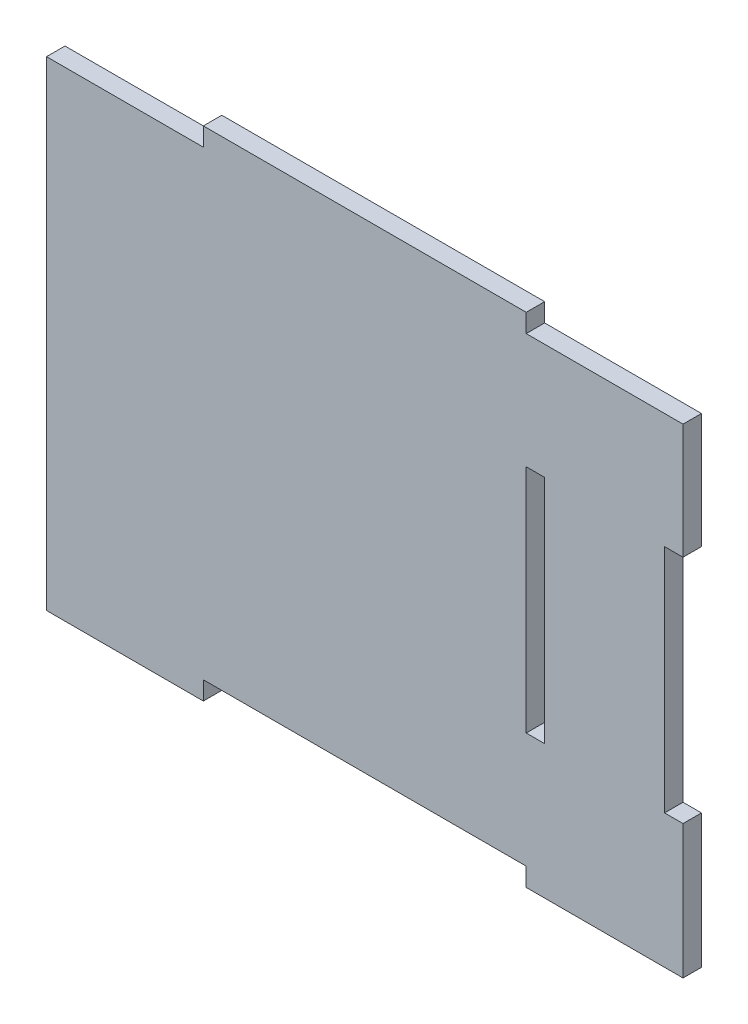
ISO-10303-21;
HEADER;
FILE_DESCRIPTION(('STEP AP214'),'2;1');
FILE_NAME('part.step','',(''),(''),'','','');
FILE_SCHEMA(('AUTOMOTIVE_DESIGN { 1 0 10303 214 1 1 1 1 }'));
ENDSEC;
DATA;
#1=APPLICATION_CONTEXT('core data for automotive mechanical design processes');
#2=APPLICATION_PROTOCOL_DEFINITION('international standard','automotive_design',2000,#1);
#3=PRODUCT_CONTEXT('',#1,'mechanical');
#4=PRODUCT('Part','Part','',(#3));
#5=PRODUCT_RELATED_PRODUCT_CATEGORY('part','',(#4));
#6=PRODUCT_DEFINITION_FORMATION('','',#4);
#7=PRODUCT_DEFINITION_CONTEXT('part definition',#1,'design');
#8=PRODUCT_DEFINITION('design','',#6,#7);
#9=PRODUCT_DEFINITION_SHAPE('','',#8);
#10=(LENGTH_UNIT() NAMED_UNIT(*) SI_UNIT(.MILLI.,.METRE.));
#11=(NAMED_UNIT(*) PLANE_ANGLE_UNIT() SI_UNIT($,.RADIAN.));
#12=(NAMED_UNIT(*) SI_UNIT($,.STERADIAN.) SOLID_ANGLE_UNIT());
#13=UNCERTAINTY_MEASURE_WITH_UNIT(LENGTH_MEASURE(1.E-05),#10,'distance_accuracy_value','');
#14=(GEOMETRIC_REPRESENTATION_CONTEXT(3) GLOBAL_UNCERTAINTY_ASSIGNED_CONTEXT((#13)) GLOBAL_UNIT_ASSIGNED_CONTEXT((#10,
#11,#12)) REPRESENTATION_CONTEXT('',''));
#15=CARTESIAN_POINT('',(0.,0.,0.));
#16=DIRECTION('',(0.,0.,1.));
#17=DIRECTION('',(1.,0.,0.));
#18=AXIS2_PLACEMENT_3D('',#15,#16,#17);
#19=CARTESIAN_POINT('',(0.,0.,4.));
#20=DIRECTION('',(0.,0.,-1.));
#21=DIRECTION('',(-1.,0.,0.));
#22=AXIS2_PLACEMENT_3D('',#19,#20,#21);
#23=PLANE('',#22);
#24=DIRECTION('',(-1.,0.,0.));
#25=VECTOR('',#24,1.);
#26=CARTESIAN_POINT('',(64.6196365221436,50.6073636958039,4.));
#27=LINE('',#26,#25);
#28=CARTESIAN_POINT('',(68.6196365221436,50.6073636958039,4.));
#29=VERTEX_POINT('',#28);
#30=CARTESIAN_POINT('',(34.6196365221436,50.6073636958039,4.));
#31=VERTEX_POINT('',#30);
#32=EDGE_CURVE('E206',#29,#31,#27,.T.);
#33=ORIENTED_EDGE('',*,*,#32,.T.);
#34=DIRECTION('',(0.,1.,0.));
#35=VECTOR('',#34,1.);
#36=CARTESIAN_POINT('',(34.6196365221436,50.6073636958039,4.));
#37=LINE('',#36,#35);
#38=CARTESIAN_POINT('',(34.6196365221436,54.6073636958039,4.));
#39=VERTEX_POINT('',#38);
#40=EDGE_CURVE('E208',#31,#39,#37,.T.);
#41=ORIENTED_EDGE('',*,*,#40,.T.);
#42=DIRECTION('',(-1.,0.,0.));
#43=VECTOR('',#42,1.);
#44=CARTESIAN_POINT('',(-35.3803634778564,54.6073636958039,4.));
#45=LINE('',#44,#43);
#46=CARTESIAN_POINT('',(-35.3803634778564,54.6073636958039,4.));
#47=VERTEX_POINT('',#46);
#48=EDGE_CURVE('E211',#39,#47,#45,.T.);
#49=ORIENTED_EDGE('',*,*,#48,.T.);
#50=DIRECTION('',(0.,-1.,0.));
#51=VECTOR('',#50,1.);
#52=CARTESIAN_POINT('',(-35.3803634778564,50.6073636958039,4.));
#53=LINE('',#52,#51);
#54=CARTESIAN_POINT('',(-35.3803634778564,50.6073636958039,4.));
#55=VERTEX_POINT('',#54);
#56=EDGE_CURVE('E213',#47,#55,#53,.T.);
#57=ORIENTED_EDGE('',*,*,#56,.T.);
#58=DIRECTION('',(-1.,0.,0.));
#59=VECTOR('',#58,1.);
#60=CARTESIAN_POINT('',(-35.3803634778564,50.6073636958039,4.));
#61=LINE('',#60,#59);
#62=CARTESIAN_POINT('',(-69.3803634778564,50.6073636958039,4.));
#63=VERTEX_POINT('',#62);
#64=EDGE_CURVE('E215',#55,#63,#61,.T.);
#65=ORIENTED_EDGE('',*,*,#64,.T.);
#66=DIRECTION('',(0.,-1.,0.));
#67=VECTOR('',#66,1.);
#68=CARTESIAN_POINT('',(-69.3803634778564,50.6073636958039,4.));
#69=LINE('',#68,#67);
#70=CARTESIAN_POINT('',(-69.3803634778564,-53.3926363041961,4.));
#71=VERTEX_POINT('',#70);
#72=EDGE_CURVE('E217',#63,#71,#69,.T.);
#73=ORIENTED_EDGE('',*,*,#72,.T.);
#74=DIRECTION('',(1.,0.,0.));
#75=VECTOR('',#74,1.);
#76=CARTESIAN_POINT('',(-65.3803634778564,-53.3926363041962,4.));
#77=LINE('',#76,#75);
#78=CARTESIAN_POINT('',(-35.3803634778564,-53.3926363041962,4.));
#79=VERTEX_POINT('',#78);
#80=EDGE_CURVE('E219',#71,#79,#77,.T.);
#81=ORIENTED_EDGE('',*,*,#80,.T.);
#82=DIRECTION('',(0.,1.,0.));
#83=VECTOR('',#82,1.);
#84=CARTESIAN_POINT('',(-35.3803634778564,-49.3926363041961,4.));
#85=LINE('',#84,#83);
#86=CARTESIAN_POINT('',(-35.3803634778564,-49.3926363041961,4.));
#87=VERTEX_POINT('',#86);
#88=EDGE_CURVE('E221',#79,#87,#85,.T.);
#89=ORIENTED_EDGE('',*,*,#88,.T.);
#90=DIRECTION('',(1.,0.,0.));
#91=VECTOR('',#90,1.);
#92=CARTESIAN_POINT('',(34.6196365221436,-49.3926363041961,4.));
#93=LINE('',#92,#91);
#94=CARTESIAN_POINT('',(34.6196365221436,-49.3926363041961,4.));
#95=VERTEX_POINT('',#94);
#96=EDGE_CURVE('E223',#87,#95,#93,.T.);
#97=ORIENTED_EDGE('',*,*,#96,.T.);
#98=DIRECTION('',(0.,-1.,0.));
#99=VECTOR('',#98,1.);
#100=CARTESIAN_POINT('',(34.6196365221436,-49.3926363041961,4.));
#101=LINE('',#100,#99);
#102=CARTESIAN_POINT('',(34.6196365221436,-53.3926363041961,4.));
#103=VERTEX_POINT('',#102);
#104=EDGE_CURVE('E225',#95,#103,#101,.T.);
#105=ORIENTED_EDGE('',*,*,#104,.T.);
#106=DIRECTION('',(1.,0.,0.));
#107=VECTOR('',#106,1.);
#108=CARTESIAN_POINT('',(64.6196365221436,-53.3926363041961,4.));
#109=LINE('',#108,#107);
#110=CARTESIAN_POINT('',(68.6196365221437,-53.3926363041961,4.));
#111=VERTEX_POINT('',#110);
#112=EDGE_CURVE('E227',#103,#111,#109,.T.);
#113=ORIENTED_EDGE('',*,*,#112,.T.);
#114=DIRECTION('',(0.,1.,0.));
#115=VECTOR('',#114,1.);
#116=CARTESIAN_POINT('',(68.6196365221437,-24.3926363041961,4.));
#117=LINE('',#116,#115);
#118=CARTESIAN_POINT('',(68.6196365221437,-24.3926363041961,4.));
#119=VERTEX_POINT('',#118);
#120=EDGE_CURVE('E229',#111,#119,#117,.T.);
#121=ORIENTED_EDGE('',*,*,#120,.T.);
#122=DIRECTION('',(-1.,0.,0.));
#123=VECTOR('',#122,1.);
#124=CARTESIAN_POINT('',(64.6196365221436,-24.3926363041961,4.));
#125=LINE('',#124,#123);
#126=CARTESIAN_POINT('',(64.6196365221436,-24.3926363041961,4.));
#127=VERTEX_POINT('',#126);
#128=EDGE_CURVE('E231',#119,#127,#125,.T.);
#129=ORIENTED_EDGE('',*,*,#128,.T.);
#130=DIRECTION('',(0.,1.,0.));
#131=VECTOR('',#130,1.);
#132=CARTESIAN_POINT('',(64.6196365221436,-24.3926363041961,4.));
#133=LINE('',#132,#131);
#134=CARTESIAN_POINT('',(64.6196365221436,25.6073636958039,4.));
#135=VERTEX_POINT('',#134);
#136=EDGE_CURVE('E233',#127,#135,#133,.T.);
#137=ORIENTED_EDGE('',*,*,#136,.T.);
#138=DIRECTION('',(1.,0.,0.));
#139=VECTOR('',#138,1.);
#140=CARTESIAN_POINT('',(64.6196365221436,25.6073636958039,4.));
#141=LINE('',#140,#139);
#142=CARTESIAN_POINT('',(68.6196365221436,25.6073636958039,4.));
#143=VERTEX_POINT('',#142);
#144=EDGE_CURVE('E235',#135,#143,#141,.T.);
#145=ORIENTED_EDGE('',*,*,#144,.T.);
#146=DIRECTION('',(0.,1.,0.));
#147=VECTOR('',#146,1.);
#148=CARTESIAN_POINT('',(68.6196365221436,50.6073636958039,4.));
#149=LINE('',#148,#147);
#150=EDGE_CURVE('E237',#143,#29,#149,.T.);
#151=ORIENTED_EDGE('',*,*,#150,.T.);
#152=EDGE_LOOP('',(#33,#41,#49,#57,#65,#73,#81,#89,#97,#105,#113,#121,#129,#137,#145,#151));
#153=FACE_BOUND('',#152,.T.);
#154=DIRECTION('',(0.,-1.,0.));
#155=VECTOR('',#154,1.);
#156=CARTESIAN_POINT('',(34.6196365221436,25.6073636958039,4.));
#157=LINE('',#156,#155);
#158=CARTESIAN_POINT('',(34.6196365221436,25.6073636958039,4.));
#159=VERTEX_POINT('',#158);
#160=CARTESIAN_POINT('',(34.6196365221436,-24.3926363041961,4.));
#161=VERTEX_POINT('',#160);
#162=EDGE_CURVE('E170',#159,#161,#157,.T.);
#163=ORIENTED_EDGE('',*,*,#162,.F.);
#164=DIRECTION('',(-1.,0.,0.));
#165=VECTOR('',#164,1.);
#166=CARTESIAN_POINT('',(34.6196365221436,25.6073636958039,4.));
#167=LINE('',#166,#165);
#168=CARTESIAN_POINT('',(38.6196365221436,25.6073636958039,4.));
#169=VERTEX_POINT('',#168);
#170=EDGE_CURVE('E192',#169,#159,#167,.T.);
#171=ORIENTED_EDGE('',*,*,#170,.F.);
#172=DIRECTION('',(0.,1.,0.));
#173=VECTOR('',#172,1.);
#174=CARTESIAN_POINT('',(38.6196365221436,25.6073636958039,4.));
#175=LINE('',#174,#173);
#176=CARTESIAN_POINT('',(38.6196365221436,-24.3926363041961,4.));
#177=VERTEX_POINT('',#176);
#178=EDGE_CURVE('E190',#177,#169,#175,.T.);
#179=ORIENTED_EDGE('',*,*,#178,.F.);
#180=DIRECTION('',(1.,0.,0.));
#181=VECTOR('',#180,1.);
#182=CARTESIAN_POINT('',(34.6196365221436,-24.3926363041961,4.));
#183=LINE('',#182,#181);
#184=EDGE_CURVE('E178',#161,#177,#183,.T.);
#185=ORIENTED_EDGE('',*,*,#184,.F.);
#186=EDGE_LOOP('',(#163,#171,#179,#185));
#187=FACE_BOUND('',#186,.T.);
#188=ADVANCED_FACE('F33',(#153,#187),#23,.F.);
#189=CARTESIAN_POINT('',(0.,0.,0.));
#190=DIRECTION('',(0.,0.,-1.));
#191=DIRECTION('',(-1.,0.,0.));
#192=AXIS2_PLACEMENT_3D('',#189,#190,#191);
#193=PLANE('',#192);
#194=DIRECTION('',(-1.,0.,0.));
#195=VECTOR('',#194,1.);
#196=CARTESIAN_POINT('',(64.6196365221436,50.6073636958039,0.));
#197=LINE('',#196,#195);
#198=CARTESIAN_POINT('',(68.6196365221436,50.6073636958039,0.));
#199=VERTEX_POINT('',#198);
#200=CARTESIAN_POINT('',(34.6196365221436,50.6073636958039,0.));
#201=VERTEX_POINT('',#200);
#202=EDGE_CURVE('E186',#199,#201,#197,.T.);
#203=ORIENTED_EDGE('',*,*,#202,.F.);
#204=DIRECTION('',(0.,1.,0.));
#205=VECTOR('',#204,1.);
#206=CARTESIAN_POINT('',(68.6196365221436,50.6073636958039,0.));
#207=LINE('',#206,#205);
#208=CARTESIAN_POINT('',(68.6196365221436,25.6073636958039,0.));
#209=VERTEX_POINT('',#208);
#210=EDGE_CURVE('E209',#209,#199,#207,.T.);
#211=ORIENTED_EDGE('',*,*,#210,.F.);
#212=DIRECTION('',(1.,0.,0.));
#213=VECTOR('',#212,1.);
#214=CARTESIAN_POINT('',(64.6196365221436,25.6073636958039,0.));
#215=LINE('',#214,#213);
#216=CARTESIAN_POINT('',(64.6196365221436,25.6073636958039,0.));
#217=VERTEX_POINT('',#216);
#218=EDGE_CURVE('E270',#217,#209,#215,.T.);
#219=ORIENTED_EDGE('',*,*,#218,.F.);
#220=DIRECTION('',(0.,1.,0.));
#221=VECTOR('',#220,1.);
#222=CARTESIAN_POINT('',(64.6196365221436,-24.3926363041961,0.));
#223=LINE('',#222,#221);
#224=CARTESIAN_POINT('',(64.6196365221436,-24.3926363041961,0.));
#225=VERTEX_POINT('',#224);
#226=EDGE_CURVE('E268',#225,#217,#223,.T.);
#227=ORIENTED_EDGE('',*,*,#226,.F.);
#228=DIRECTION('',(-1.,0.,0.));
#229=VECTOR('',#228,1.);
#230=CARTESIAN_POINT('',(64.6196365221436,-24.3926363041961,0.));
#231=LINE('',#230,#229);
#232=CARTESIAN_POINT('',(68.6196365221437,-24.3926363041961,0.));
#233=VERTEX_POINT('',#232);
#234=EDGE_CURVE('E266',#233,#225,#231,.T.);
#235=ORIENTED_EDGE('',*,*,#234,.F.);
#236=DIRECTION('',(0.,1.,0.));
#237=VECTOR('',#236,1.);
#238=CARTESIAN_POINT('',(68.6196365221437,-24.3926363041961,0.));
#239=LINE('',#238,#237);
#240=CARTESIAN_POINT('',(68.6196365221437,-53.3926363041961,0.));
#241=VERTEX_POINT('',#240);
#242=EDGE_CURVE('E264',#241,#233,#239,.T.);
#243=ORIENTED_EDGE('',*,*,#242,.F.);
#244=DIRECTION('',(1.,0.,0.));
#245=VECTOR('',#244,1.);
#246=CARTESIAN_POINT('',(64.6196365221436,-53.3926363041961,0.));
#247=LINE('',#246,#245);
#248=CARTESIAN_POINT('',(34.6196365221436,-53.3926363041961,0.));
#249=VERTEX_POINT('',#248);
#250=EDGE_CURVE('E262',#249,#241,#247,.T.);
#251=ORIENTED_EDGE('',*,*,#250,.F.);
#252=DIRECTION('',(0.,-1.,0.));
#253=VECTOR('',#252,1.);
#254=CARTESIAN_POINT('',(34.6196365221436,-49.3926363041961,0.));
#255=LINE('',#254,#253);
#256=CARTESIAN_POINT('',(34.6196365221436,-49.3926363041961,0.));
#257=VERTEX_POINT('',#256);
#258=EDGE_CURVE('E259',#257,#249,#255,.T.);
#259=ORIENTED_EDGE('',*,*,#258,.F.);
#260=DIRECTION('',(1.,0.,0.));
#261=VECTOR('',#260,1.);
#262=CARTESIAN_POINT('',(34.6196365221436,-49.3926363041961,0.));
#263=LINE('',#262,#261);
#264=CARTESIAN_POINT('',(-35.3803634778564,-49.3926363041961,0.));
#265=VERTEX_POINT('',#264);
#266=EDGE_CURVE('E257',#265,#257,#263,.T.);
#267=ORIENTED_EDGE('',*,*,#266,.F.);
#268=DIRECTION('',(0.,1.,0.));
#269=VECTOR('',#268,1.);
#270=CARTESIAN_POINT('',(-35.3803634778564,-49.3926363041961,0.));
#271=LINE('',#270,#269);
#272=CARTESIAN_POINT('',(-35.3803634778564,-53.3926363041962,0.));
#273=VERTEX_POINT('',#272);
#274=EDGE_CURVE('E255',#273,#265,#271,.T.);
#275=ORIENTED_EDGE('',*,*,#274,.F.);
#276=DIRECTION('',(1.,0.,0.));
#277=VECTOR('',#276,1.);
#278=CARTESIAN_POINT('',(-65.3803634778564,-53.3926363041962,0.));
#279=LINE('',#278,#277);
#280=CARTESIAN_POINT('',(-69.3803634778564,-53.3926363041961,0.));
#281=VERTEX_POINT('',#280);
#282=EDGE_CURVE('E253',#281,#273,#279,.T.);
#283=ORIENTED_EDGE('',*,*,#282,.F.);
#284=DIRECTION('',(0.,-1.,0.));
#285=VECTOR('',#284,1.);
#286=CARTESIAN_POINT('',(-69.3803634778564,50.6073636958039,0.));
#287=LINE('',#286,#285);
#288=CARTESIAN_POINT('',(-69.3803634778564,50.6073636958039,0.));
#289=VERTEX_POINT('',#288);
#290=EDGE_CURVE('E250',#289,#281,#287,.T.);
#291=ORIENTED_EDGE('',*,*,#290,.F.);
#292=DIRECTION('',(-1.,0.,0.));
#293=VECTOR('',#292,1.);
#294=CARTESIAN_POINT('',(-65.3803634778564,50.6073636958039,0.));
#295=LINE('',#294,#293);
#296=CARTESIAN_POINT('',(-35.3803634778564,50.6073636958039,0.));
#297=VERTEX_POINT('',#296);
#298=EDGE_CURVE('E248',#297,#289,#295,.T.);
#299=ORIENTED_EDGE('',*,*,#298,.F.);
#300=DIRECTION('',(0.,-1.,0.));
#301=VECTOR('',#300,1.);
#302=CARTESIAN_POINT('',(-35.3803634778564,50.6073636958039,0.));
#303=LINE('',#302,#301);
#304=CARTESIAN_POINT('',(-35.3803634778564,54.6073636958039,0.));
#305=VERTEX_POINT('',#304);
#306=EDGE_CURVE('E245',#305,#297,#303,.T.);
#307=ORIENTED_EDGE('',*,*,#306,.F.);
#308=DIRECTION('',(-1.,0.,0.));
#309=VECTOR('',#308,1.);
#310=CARTESIAN_POINT('',(-35.3803634778564,54.6073636958039,0.));
#311=LINE('',#310,#309);
#312=CARTESIAN_POINT('',(34.6196365221436,54.6073636958039,0.));
#313=VERTEX_POINT('',#312);
#314=EDGE_CURVE('E243',#313,#305,#311,.T.);
#315=ORIENTED_EDGE('',*,*,#314,.F.);
#316=DIRECTION('',(0.,1.,0.));
#317=VECTOR('',#316,1.);
#318=CARTESIAN_POINT('',(34.6196365221436,50.6073636958039,0.));
#319=LINE('',#318,#317);
#320=EDGE_CURVE('E241',#201,#313,#319,.T.);
#321=ORIENTED_EDGE('',*,*,#320,.F.);
#322=EDGE_LOOP('',(#203,#211,#219,#227,#235,#243,#251,#259,#267,#275,#283,#291,#299,#307,#315,#321));
#323=FACE_BOUND('',#322,.T.);
#324=DIRECTION('',(-1.,0.,0.));
#325=VECTOR('',#324,1.);
#326=CARTESIAN_POINT('',(34.6196365221436,25.6073636958039,0.));
#327=LINE('',#326,#325);
#328=CARTESIAN_POINT('',(38.6196365221436,25.6073636958039,0.));
#329=VERTEX_POINT('',#328);
#330=CARTESIAN_POINT('',(34.6196365221436,25.6073636958039,0.));
#331=VERTEX_POINT('',#330);
#332=EDGE_CURVE('E179',#329,#331,#327,.T.);
#333=ORIENTED_EDGE('',*,*,#332,.T.);
#334=DIRECTION('',(0.,-1.,0.));
#335=VECTOR('',#334,1.);
#336=CARTESIAN_POINT('',(34.6196365221436,25.6073636958039,0.));
#337=LINE('',#336,#335);
#338=CARTESIAN_POINT('',(34.6196365221436,-24.3926363041961,0.));
#339=VERTEX_POINT('',#338);
#340=EDGE_CURVE('E56',#331,#339,#337,.T.);
#341=ORIENTED_EDGE('',*,*,#340,.T.);
#342=DIRECTION('',(1.,0.,0.));
#343=VECTOR('',#342,1.);
#344=CARTESIAN_POINT('',(34.6196365221436,-24.3926363041961,0.));
#345=LINE('',#344,#343);
#346=CARTESIAN_POINT('',(38.6196365221436,-24.3926363041961,0.));
#347=VERTEX_POINT('',#346);
#348=EDGE_CURVE('E185',#339,#347,#345,.T.);
#349=ORIENTED_EDGE('',*,*,#348,.T.);
#350=DIRECTION('',(0.,1.,0.));
#351=VECTOR('',#350,1.);
#352=CARTESIAN_POINT('',(38.6196365221436,25.6073636958039,0.));
#353=LINE('',#352,#351);
#354=EDGE_CURVE('E198',#347,#329,#353,.T.);
#355=ORIENTED_EDGE('',*,*,#354,.T.);
#356=EDGE_LOOP('',(#333,#341,#349,#355));
#357=FACE_BOUND('',#356,.T.);
#358=ADVANCED_FACE('F326',(#323,#357),#193,.T.);
#359=CARTESIAN_POINT('',(64.6196365221436,50.6073636958039,4.));
#360=DIRECTION('',(0.,-1.,0.));
#361=DIRECTION('',(0.,0.,-1.));
#362=AXIS2_PLACEMENT_3D('',#359,#360,#361);
#363=PLANE('',#362);
#364=ORIENTED_EDGE('',*,*,#202,.T.);
#365=DIRECTION('',(0.,0.,-1.));
#366=VECTOR('',#365,1.);
#367=CARTESIAN_POINT('',(34.6196365221436,50.6073636958039,4.));
#368=LINE('',#367,#366);
#369=EDGE_CURVE('E11',#31,#201,#368,.T.);
#370=ORIENTED_EDGE('',*,*,#369,.F.);
#371=ORIENTED_EDGE('',*,*,#32,.F.);
#372=DIRECTION('',(0.,0.,-1.));
#373=VECTOR('',#372,1.);
#374=CARTESIAN_POINT('',(68.6196365221436,50.6073636958039,4.));
#375=LINE('',#374,#373);
#376=EDGE_CURVE('E239',#29,#199,#375,.T.);
#377=ORIENTED_EDGE('',*,*,#376,.T.);
#378=EDGE_LOOP('',(#364,#370,#371,#377));
#379=FACE_BOUND('',#378,.T.);
#380=ADVANCED_FACE('F35',(#379),#363,.F.);
#381=CARTESIAN_POINT('',(34.6196365221436,50.6073636958039,4.));
#382=DIRECTION('',(-1.,0.,0.));
#383=DIRECTION('',(0.,0.,1.));
#384=AXIS2_PLACEMENT_3D('',#381,#382,#383);
#385=PLANE('',#384);
#386=ORIENTED_EDGE('',*,*,#320,.T.);
#387=DIRECTION('',(0.,0.,-1.));
#388=VECTOR('',#387,1.);
#389=CARTESIAN_POINT('',(34.6196365221436,54.6073636958039,4.));
#390=LINE('',#389,#388);
#391=EDGE_CURVE('E41',#39,#313,#390,.T.);
#392=ORIENTED_EDGE('',*,*,#391,.F.);
#393=ORIENTED_EDGE('',*,*,#40,.F.);
#394=ORIENTED_EDGE('',*,*,#369,.T.);
#395=EDGE_LOOP('',(#386,#392,#393,#394));
#396=FACE_BOUND('',#395,.T.);
#397=ADVANCED_FACE('F342',(#396),#385,.F.);
#398=CARTESIAN_POINT('',(-35.3803634778564,54.6073636958039,4.));
#399=DIRECTION('',(0.,-1.,0.));
#400=DIRECTION('',(0.,0.,-1.));
#401=AXIS2_PLACEMENT_3D('',#398,#399,#400);
#402=PLANE('',#401);
#403=ORIENTED_EDGE('',*,*,#314,.T.);
#404=DIRECTION('',(0.,0.,-1.));
#405=VECTOR('',#404,1.);
#406=CARTESIAN_POINT('',(-35.3803634778564,54.6073636958039,4.));
#407=LINE('',#406,#405);
#408=EDGE_CURVE('E312',#47,#305,#407,.T.);
#409=ORIENTED_EDGE('',*,*,#408,.F.);
#410=ORIENTED_EDGE('',*,*,#48,.F.);
#411=ORIENTED_EDGE('',*,*,#391,.T.);
#412=EDGE_LOOP('',(#403,#409,#410,#411));
#413=FACE_BOUND('',#412,.T.);
#414=ADVANCED_FACE('F319',(#413),#402,.F.);
#415=CARTESIAN_POINT('',(-35.3803634778564,50.6073636958039,4.));
#416=DIRECTION('',(1.,0.,0.));
#417=DIRECTION('',(0.,0.,-1.));
#418=AXIS2_PLACEMENT_3D('',#415,#416,#417);
#419=PLANE('',#418);
#420=ORIENTED_EDGE('',*,*,#306,.T.);
#421=DIRECTION('',(0.,0.,-1.));
#422=VECTOR('',#421,1.);
#423=CARTESIAN_POINT('',(-35.3803634778564,50.6073636958039,4.));
#424=LINE('',#423,#422);
#425=EDGE_CURVE('E309',#55,#297,#424,.T.);
#426=ORIENTED_EDGE('',*,*,#425,.F.);
#427=ORIENTED_EDGE('',*,*,#56,.F.);
#428=ORIENTED_EDGE('',*,*,#408,.T.);
#429=EDGE_LOOP('',(#420,#426,#427,#428));
#430=FACE_BOUND('',#429,.T.);
#431=ADVANCED_FACE('F331',(#430),#419,.F.);
#432=CARTESIAN_POINT('',(-65.3803634778564,50.6073636958039,4.));
#433=DIRECTION('',(0.,-1.,0.));
#434=DIRECTION('',(0.,0.,-1.));
#435=AXIS2_PLACEMENT_3D('',#432,#433,#434);
#436=PLANE('',#435);
#437=ORIENTED_EDGE('',*,*,#298,.T.);
#438=DIRECTION('',(0.,0.,-1.));
#439=VECTOR('',#438,1.);
#440=CARTESIAN_POINT('',(-69.3803634778564,50.6073636958039,4.));
#441=LINE('',#440,#439);
#442=EDGE_CURVE('E306',#63,#289,#441,.T.);
#443=ORIENTED_EDGE('',*,*,#442,.F.);
#444=ORIENTED_EDGE('',*,*,#64,.F.);
#445=ORIENTED_EDGE('',*,*,#425,.T.);
#446=EDGE_LOOP('',(#437,#443,#444,#445));
#447=FACE_BOUND('',#446,.T.);
#448=ADVANCED_FACE('F335',(#447),#436,.F.);
#449=CARTESIAN_POINT('',(-69.3803634778564,50.6073636958039,4.));
#450=DIRECTION('',(1.,0.,0.));
#451=DIRECTION('',(0.,1.,0.));
#452=AXIS2_PLACEMENT_3D('',#449,#450,#451);
#453=PLANE('',#452);
#454=ORIENTED_EDGE('',*,*,#290,.T.);
#455=DIRECTION('',(0.,0.,-1.));
#456=VECTOR('',#455,1.);
#457=CARTESIAN_POINT('',(-69.3803634778564,-53.3926363041961,4.));
#458=LINE('',#457,#456);
#459=EDGE_CURVE('E303',#71,#281,#458,.T.);
#460=ORIENTED_EDGE('',*,*,#459,.F.);
#461=ORIENTED_EDGE('',*,*,#72,.F.);
#462=ORIENTED_EDGE('',*,*,#442,.T.);
#463=EDGE_LOOP('',(#454,#460,#461,#462));
#464=FACE_BOUND('',#463,.T.);
#465=ADVANCED_FACE('F393',(#464),#453,.F.);
#466=CARTESIAN_POINT('',(-65.3803634778564,-53.3926363041962,4.));
#467=DIRECTION('',(0.,1.,0.));
#468=DIRECTION('',(-1.,0.,0.));
#469=AXIS2_PLACEMENT_3D('',#466,#467,#468);
#470=PLANE('',#469);
#471=ORIENTED_EDGE('',*,*,#282,.T.);
#472=DIRECTION('',(0.,0.,-1.));
#473=VECTOR('',#472,1.);
#474=CARTESIAN_POINT('',(-35.3803634778564,-53.3926363041962,4.));
#475=LINE('',#474,#473);
#476=EDGE_CURVE('E300',#79,#273,#475,.T.);
#477=ORIENTED_EDGE('',*,*,#476,.F.);
#478=ORIENTED_EDGE('',*,*,#80,.F.);
#479=ORIENTED_EDGE('',*,*,#459,.T.);
#480=EDGE_LOOP('',(#471,#477,#478,#479));
#481=FACE_BOUND('',#480,.T.);
#482=ADVANCED_FACE('F391',(#481),#470,.F.);
#483=CARTESIAN_POINT('',(-35.3803634778564,-49.3926363041961,4.));
#484=DIRECTION('',(-1.,0.,0.));
#485=DIRECTION('',(0.,0.,1.));
#486=AXIS2_PLACEMENT_3D('',#483,#484,#485);
#487=PLANE('',#486);
#488=ORIENTED_EDGE('',*,*,#274,.T.);
#489=DIRECTION('',(0.,0.,-1.));
#490=VECTOR('',#489,1.);
#491=CARTESIAN_POINT('',(-35.3803634778564,-49.3926363041961,4.));
#492=LINE('',#491,#490);
#493=EDGE_CURVE('E297',#87,#265,#492,.T.);
#494=ORIENTED_EDGE('',*,*,#493,.F.);
#495=ORIENTED_EDGE('',*,*,#88,.F.);
#496=ORIENTED_EDGE('',*,*,#476,.T.);
#497=EDGE_LOOP('',(#488,#494,#495,#496));
#498=FACE_BOUND('',#497,.T.);
#499=ADVANCED_FACE('F387',(#498),#487,.F.);
#500=CARTESIAN_POINT('',(34.6196365221436,-49.3926363041961,4.));
#501=DIRECTION('',(0.,1.,0.));
#502=DIRECTION('',(-1.,0.,0.));
#503=AXIS2_PLACEMENT_3D('',#500,#501,#502);
#504=PLANE('',#503);
#505=ORIENTED_EDGE('',*,*,#266,.T.);
#506=DIRECTION('',(0.,0.,-1.));
#507=VECTOR('',#506,1.);
#508=CARTESIAN_POINT('',(34.6196365221436,-49.3926363041961,4.));
#509=LINE('',#508,#507);
#510=EDGE_CURVE('E294',#95,#257,#509,.T.);
#511=ORIENTED_EDGE('',*,*,#510,.F.);
#512=ORIENTED_EDGE('',*,*,#96,.F.);
#513=ORIENTED_EDGE('',*,*,#493,.T.);
#514=EDGE_LOOP('',(#505,#511,#512,#513));
#515=FACE_BOUND('',#514,.T.);
#516=ADVANCED_FACE('F384',(#515),#504,.F.);
#517=CARTESIAN_POINT('',(34.6196365221436,-49.3926363041961,4.));
#518=DIRECTION('',(1.,0.,0.));
#519=DIRECTION('',(0.,0.,-1.));
#520=AXIS2_PLACEMENT_3D('',#517,#518,#519);
#521=PLANE('',#520);
#522=ORIENTED_EDGE('',*,*,#258,.T.);
#523=DIRECTION('',(0.,0.,-1.));
#524=VECTOR('',#523,1.);
#525=CARTESIAN_POINT('',(34.6196365221436,-53.3926363041961,4.));
#526=LINE('',#525,#524);
#527=EDGE_CURVE('E291',#103,#249,#526,.T.);
#528=ORIENTED_EDGE('',*,*,#527,.F.);
#529=ORIENTED_EDGE('',*,*,#104,.F.);
#530=ORIENTED_EDGE('',*,*,#510,.T.);
#531=EDGE_LOOP('',(#522,#528,#529,#530));
#532=FACE_BOUND('',#531,.T.);
#533=ADVANCED_FACE('F375',(#532),#521,.F.);
#534=CARTESIAN_POINT('',(64.6196365221436,-53.3926363041961,4.));
#535=DIRECTION('',(0.,1.,0.));
#536=DIRECTION('',(0.,0.,1.));
#537=AXIS2_PLACEMENT_3D('',#534,#535,#536);
#538=PLANE('',#537);
#539=ORIENTED_EDGE('',*,*,#250,.T.);
#540=DIRECTION('',(0.,0.,-1.));
#541=VECTOR('',#540,1.);
#542=CARTESIAN_POINT('',(68.6196365221437,-53.3926363041961,4.));
#543=LINE('',#542,#541);
#544=EDGE_CURVE('E288',#111,#241,#543,.T.);
#545=ORIENTED_EDGE('',*,*,#544,.F.);
#546=ORIENTED_EDGE('',*,*,#112,.F.);
#547=ORIENTED_EDGE('',*,*,#527,.T.);
#548=EDGE_LOOP('',(#539,#545,#546,#547));
#549=FACE_BOUND('',#548,.T.);
#550=ADVANCED_FACE('F379',(#549),#538,.F.);
#551=CARTESIAN_POINT('',(68.6196365221437,-24.3926363041961,4.));
#552=DIRECTION('',(-1.,0.,0.));
#553=DIRECTION('',(0.,0.,1.));
#554=AXIS2_PLACEMENT_3D('',#551,#552,#553);
#555=PLANE('',#554);
#556=ORIENTED_EDGE('',*,*,#242,.T.);
#557=DIRECTION('',(0.,0.,-1.));
#558=VECTOR('',#557,1.);
#559=CARTESIAN_POINT('',(68.6196365221437,-24.3926363041961,4.));
#560=LINE('',#559,#558);
#561=EDGE_CURVE('E285',#119,#233,#560,.T.);
#562=ORIENTED_EDGE('',*,*,#561,.F.);
#563=ORIENTED_EDGE('',*,*,#120,.F.);
#564=ORIENTED_EDGE('',*,*,#544,.T.);
#565=EDGE_LOOP('',(#556,#562,#563,#564));
#566=FACE_BOUND('',#565,.T.);
#567=ADVANCED_FACE('F368',(#566),#555,.F.);
#568=CARTESIAN_POINT('',(64.6196365221436,-24.3926363041961,4.));
#569=DIRECTION('',(0.,-1.,0.));
#570=DIRECTION('',(0.,0.,-1.));
#571=AXIS2_PLACEMENT_3D('',#568,#569,#570);
#572=PLANE('',#571);
#573=ORIENTED_EDGE('',*,*,#234,.T.);
#574=DIRECTION('',(0.,0.,-1.));
#575=VECTOR('',#574,1.);
#576=CARTESIAN_POINT('',(64.6196365221436,-24.3926363041961,4.));
#577=LINE('',#576,#575);
#578=EDGE_CURVE('E282',#127,#225,#577,.T.);
#579=ORIENTED_EDGE('',*,*,#578,.F.);
#580=ORIENTED_EDGE('',*,*,#128,.F.);
#581=ORIENTED_EDGE('',*,*,#561,.T.);
#582=EDGE_LOOP('',(#573,#579,#580,#581));
#583=FACE_BOUND('',#582,.T.);
#584=ADVANCED_FACE('F364',(#583),#572,.F.);
#585=CARTESIAN_POINT('',(64.6196365221436,-24.3926363041961,4.));
#586=DIRECTION('',(-1.,0.,0.));
#587=DIRECTION('',(0.,0.,1.));
#588=AXIS2_PLACEMENT_3D('',#585,#586,#587);
#589=PLANE('',#588);
#590=ORIENTED_EDGE('',*,*,#226,.T.);
#591=DIRECTION('',(0.,0.,-1.));
#592=VECTOR('',#591,1.);
#593=CARTESIAN_POINT('',(64.6196365221436,25.6073636958039,4.));
#594=LINE('',#593,#592);
#595=EDGE_CURVE('E279',#135,#217,#594,.T.);
#596=ORIENTED_EDGE('',*,*,#595,.F.);
#597=ORIENTED_EDGE('',*,*,#136,.F.);
#598=ORIENTED_EDGE('',*,*,#578,.T.);
#599=EDGE_LOOP('',(#590,#596,#597,#598));
#600=FACE_BOUND('',#599,.T.);
#601=ADVANCED_FACE('F359',(#600),#589,.F.);
#602=CARTESIAN_POINT('',(64.6196365221436,25.6073636958039,4.));
#603=DIRECTION('',(0.,1.,0.));
#604=DIRECTION('',(-1.,0.,0.));
#605=AXIS2_PLACEMENT_3D('',#602,#603,#604);
#606=PLANE('',#605);
#607=ORIENTED_EDGE('',*,*,#218,.T.);
#608=DIRECTION('',(0.,0.,-1.));
#609=VECTOR('',#608,1.);
#610=CARTESIAN_POINT('',(68.6196365221436,25.6073636958039,4.));
#611=LINE('',#610,#609);
#612=EDGE_CURVE('E276',#143,#209,#611,.T.);
#613=ORIENTED_EDGE('',*,*,#612,.F.);
#614=ORIENTED_EDGE('',*,*,#144,.F.);
#615=ORIENTED_EDGE('',*,*,#595,.T.);
#616=EDGE_LOOP('',(#607,#613,#614,#615));
#617=FACE_BOUND('',#616,.T.);
#618=ADVANCED_FACE('F353',(#617),#606,.F.);
#619=CARTESIAN_POINT('',(68.6196365221436,50.6073636958039,4.));
#620=DIRECTION('',(-1.,0.,0.));
#621=DIRECTION('',(0.,0.,1.));
#622=AXIS2_PLACEMENT_3D('',#619,#620,#621);
#623=PLANE('',#622);
#624=ORIENTED_EDGE('',*,*,#210,.T.);
#625=ORIENTED_EDGE('',*,*,#376,.F.);
#626=ORIENTED_EDGE('',*,*,#150,.F.);
#627=ORIENTED_EDGE('',*,*,#612,.T.);
#628=EDGE_LOOP('',(#624,#625,#626,#627));
#629=FACE_BOUND('',#628,.T.);
#630=ADVANCED_FACE('F348',(#629),#623,.F.);
#631=CARTESIAN_POINT('',(34.6196365221436,25.6073636958039,4.));
#632=DIRECTION('',(1.,0.,0.));
#633=DIRECTION('',(0.,0.,-1.));
#634=AXIS2_PLACEMENT_3D('',#631,#632,#633);
#635=PLANE('',#634);
#636=ORIENTED_EDGE('',*,*,#340,.F.);
#637=DIRECTION('',(0.,0.,-1.));
#638=VECTOR('',#637,1.);
#639=CARTESIAN_POINT('',(34.6196365221436,25.6073636958039,4.));
#640=LINE('',#639,#638);
#641=EDGE_CURVE('E174',#159,#331,#640,.T.);
#642=ORIENTED_EDGE('',*,*,#641,.F.);
#643=ORIENTED_EDGE('',*,*,#162,.T.);
#644=DIRECTION('',(0.,0.,-1.));
#645=VECTOR('',#644,1.);
#646=CARTESIAN_POINT('',(34.6196365221436,-24.3926363041961,4.));
#647=LINE('',#646,#645);
#648=EDGE_CURVE('E173',#161,#339,#647,.T.);
#649=ORIENTED_EDGE('',*,*,#648,.T.);
#650=EDGE_LOOP('',(#636,#642,#643,#649));
#651=FACE_BOUND('',#650,.T.);
#652=ADVANCED_FACE('F172',(#651),#635,.T.);
#653=CARTESIAN_POINT('',(34.6196365221436,-24.3926363041961,4.));
#654=DIRECTION('',(0.,1.,0.));
#655=DIRECTION('',(0.,0.,1.));
#656=AXIS2_PLACEMENT_3D('',#653,#654,#655);
#657=PLANE('',#656);
#658=ORIENTED_EDGE('',*,*,#348,.F.);
#659=ORIENTED_EDGE('',*,*,#648,.F.);
#660=ORIENTED_EDGE('',*,*,#184,.T.);
#661=DIRECTION('',(0.,0.,-1.));
#662=VECTOR('',#661,1.);
#663=CARTESIAN_POINT('',(38.6196365221436,-24.3926363041961,4.));
#664=LINE('',#663,#662);
#665=EDGE_CURVE('E187',#177,#347,#664,.T.);
#666=ORIENTED_EDGE('',*,*,#665,.T.);
#667=EDGE_LOOP('',(#658,#659,#660,#666));
#668=FACE_BOUND('',#667,.T.);
#669=ADVANCED_FACE('F182',(#668),#657,.T.);
#670=CARTESIAN_POINT('',(38.6196365221436,25.6073636958039,4.));
#671=DIRECTION('',(-1.,0.,0.));
#672=DIRECTION('',(0.,0.,1.));
#673=AXIS2_PLACEMENT_3D('',#670,#671,#672);
#674=PLANE('',#673);
#675=ORIENTED_EDGE('',*,*,#354,.F.);
#676=ORIENTED_EDGE('',*,*,#665,.F.);
#677=ORIENTED_EDGE('',*,*,#178,.T.);
#678=DIRECTION('',(0.,0.,-1.));
#679=VECTOR('',#678,1.);
#680=CARTESIAN_POINT('',(38.6196365221436,25.6073636958039,4.));
#681=LINE('',#680,#679);
#682=EDGE_CURVE('E48',#169,#329,#681,.T.);
#683=ORIENTED_EDGE('',*,*,#682,.T.);
#684=EDGE_LOOP('',(#675,#676,#677,#683));
#685=FACE_BOUND('',#684,.T.);
#686=ADVANCED_FACE('F475',(#685),#674,.T.);
#687=CARTESIAN_POINT('',(34.6196365221436,25.6073636958039,4.));
#688=DIRECTION('',(0.,-1.,0.));
#689=DIRECTION('',(1.,0.,0.));
#690=AXIS2_PLACEMENT_3D('',#687,#688,#689);
#691=PLANE('',#690);
#692=ORIENTED_EDGE('',*,*,#332,.F.);
#693=ORIENTED_EDGE('',*,*,#682,.F.);
#694=ORIENTED_EDGE('',*,*,#170,.T.);
#695=ORIENTED_EDGE('',*,*,#641,.T.);
#696=EDGE_LOOP('',(#692,#693,#694,#695));
#697=FACE_BOUND('',#696,.T.);
#698=ADVANCED_FACE('F481',(#697),#691,.T.);
#699=CLOSED_SHELL('',(#188,#358,#380,#397,#414,#431,#448,#465,#482,#499,#516,#533,#550,#567,
#584,#601,#618,#630,#652,#669,#686,#698));
#700=MANIFOLD_SOLID_BREP('B2',#699);
#701=ADVANCED_BREP_SHAPE_REPRESENTATION('',(#18,#700),#14);
#702=SHAPE_DEFINITION_REPRESENTATION(#9,#701);
ENDSEC;
END-ISO-10303-21;
